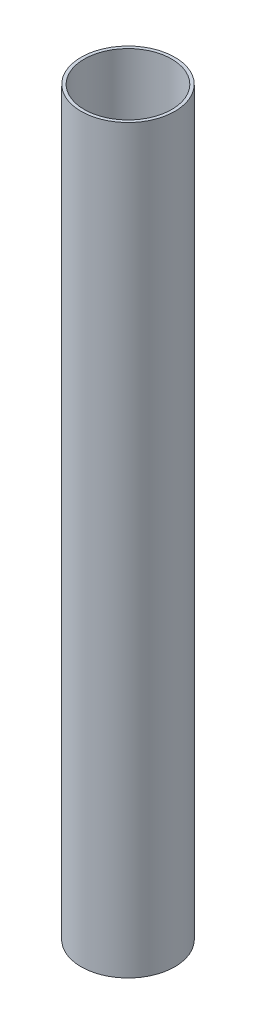
ISO-10303-21;
HEADER;
FILE_DESCRIPTION(('STEP AP214'),'2;1');
FILE_NAME('part.step','',(''),(''),'','','');
FILE_SCHEMA(('AUTOMOTIVE_DESIGN { 1 0 10303 214 1 1 1 1 }'));
ENDSEC;
DATA;
#1=APPLICATION_CONTEXT('core data for automotive mechanical design processes');
#2=APPLICATION_PROTOCOL_DEFINITION('international standard','automotive_design',2000,#1);
#3=PRODUCT_CONTEXT('',#1,'mechanical');
#4=PRODUCT('Part','Part','',(#3));
#5=PRODUCT_RELATED_PRODUCT_CATEGORY('part','',(#4));
#6=PRODUCT_DEFINITION_FORMATION('','',#4);
#7=PRODUCT_DEFINITION_CONTEXT('part definition',#1,'design');
#8=PRODUCT_DEFINITION('design','',#6,#7);
#9=PRODUCT_DEFINITION_SHAPE('','',#8);
#10=(LENGTH_UNIT() NAMED_UNIT(*) SI_UNIT(.MILLI.,.METRE.));
#11=(NAMED_UNIT(*) PLANE_ANGLE_UNIT() SI_UNIT($,.RADIAN.));
#12=(NAMED_UNIT(*) SI_UNIT($,.STERADIAN.) SOLID_ANGLE_UNIT());
#13=UNCERTAINTY_MEASURE_WITH_UNIT(LENGTH_MEASURE(1.E-05),#10,'distance_accuracy_value','');
#14=(GEOMETRIC_REPRESENTATION_CONTEXT(3) GLOBAL_UNCERTAINTY_ASSIGNED_CONTEXT((#13)) GLOBAL_UNIT_ASSIGNED_CONTEXT((#10,
#11,#12)) REPRESENTATION_CONTEXT('',''));
#15=CARTESIAN_POINT('',(0.,0.,0.));
#16=DIRECTION('',(0.,0.,1.));
#17=DIRECTION('',(1.,0.,0.));
#18=AXIS2_PLACEMENT_3D('',#15,#16,#17);
#19=CARTESIAN_POINT('',(0.,355.6,0.));
#20=DIRECTION('',(0.,1.,0.));
#21=DIRECTION('',(0.,0.,1.));
#22=AXIS2_PLACEMENT_3D('',#19,#20,#21);
#23=PLANE('',#22);
#24=CARTESIAN_POINT('',(0.,355.6,0.));
#25=DIRECTION('',(0.,1.,0.));
#26=DIRECTION('',(0.,0.,1.));
#27=AXIS2_PLACEMENT_3D('',#24,#25,#26);
#28=CIRCLE('',#27,22.5);
#29=CARTESIAN_POINT('',(0.,355.6,22.5));
#30=VERTEX_POINT('',#29);
#31=EDGE_CURVE('E10',#30,#30,#28,.T.);
#32=ORIENTED_EDGE('',*,*,#31,.T.);
#33=EDGE_LOOP('',(#32));
#34=FACE_BOUND('',#33,.T.);
#35=CARTESIAN_POINT('',(0.,355.6,0.));
#36=DIRECTION('',(0.,1.,0.));
#37=DIRECTION('',(0.,0.,1.));
#38=AXIS2_PLACEMENT_3D('',#35,#36,#37);
#39=CIRCLE('',#38,21.);
#40=CARTESIAN_POINT('',(0.,355.6,21.));
#41=VERTEX_POINT('',#40);
#42=EDGE_CURVE('E56',#41,#41,#39,.T.);
#43=ORIENTED_EDGE('',*,*,#42,.F.);
#44=EDGE_LOOP('',(#43));
#45=FACE_BOUND('',#44,.T.);
#46=ADVANCED_FACE('F43',(#34,#45),#23,.T.);
#47=CARTESIAN_POINT('',(0.,0.,0.));
#48=DIRECTION('',(0.,1.,0.));
#49=DIRECTION('',(0.,0.,1.));
#50=AXIS2_PLACEMENT_3D('',#47,#48,#49);
#51=PLANE('',#50);
#52=CARTESIAN_POINT('',(0.,0.,0.));
#53=DIRECTION('',(0.,1.,0.));
#54=DIRECTION('',(0.,0.,1.));
#55=AXIS2_PLACEMENT_3D('',#52,#53,#54);
#56=CIRCLE('',#55,22.5);
#57=CARTESIAN_POINT('',(0.,0.,22.5));
#58=VERTEX_POINT('',#57);
#59=EDGE_CURVE('E47',#58,#58,#56,.T.);
#60=ORIENTED_EDGE('',*,*,#59,.F.);
#61=EDGE_LOOP('',(#60));
#62=FACE_BOUND('',#61,.T.);
#63=CARTESIAN_POINT('',(0.,0.,0.));
#64=DIRECTION('',(0.,1.,0.));
#65=DIRECTION('',(0.,0.,1.));
#66=AXIS2_PLACEMENT_3D('',#63,#64,#65);
#67=CIRCLE('',#66,21.);
#68=CARTESIAN_POINT('',(0.,0.,21.));
#69=VERTEX_POINT('',#68);
#70=EDGE_CURVE('E58',#69,#69,#67,.T.);
#71=ORIENTED_EDGE('',*,*,#70,.T.);
#72=EDGE_LOOP('',(#71));
#73=FACE_BOUND('',#72,.T.);
#74=ADVANCED_FACE('F70',(#62,#73),#51,.F.);
#75=CARTESIAN_POINT('',(0.,355.6,0.));
#76=DIRECTION('',(0.,-1.,0.));
#77=DIRECTION('',(0.,0.,-1.));
#78=AXIS2_PLACEMENT_3D('',#75,#76,#77);
#79=CYLINDRICAL_SURFACE('',#78,22.5);
#80=ORIENTED_EDGE('',*,*,#31,.F.);
#81=EDGE_LOOP('',(#80));
#82=FACE_BOUND('',#81,.T.);
#83=ORIENTED_EDGE('',*,*,#59,.T.);
#84=EDGE_LOOP('',(#83));
#85=FACE_BOUND('',#84,.T.);
#86=ADVANCED_FACE('F45',(#82,#85),#79,.T.);
#87=CARTESIAN_POINT('',(0.,355.6,0.));
#88=DIRECTION('',(0.,-1.,0.));
#89=DIRECTION('',(0.,0.,-1.));
#90=AXIS2_PLACEMENT_3D('',#87,#88,#89);
#91=CYLINDRICAL_SURFACE('',#90,21.);
#92=ORIENTED_EDGE('',*,*,#42,.T.);
#93=EDGE_LOOP('',(#92));
#94=FACE_BOUND('',#93,.T.);
#95=ORIENTED_EDGE('',*,*,#70,.F.);
#96=EDGE_LOOP('',(#95));
#97=FACE_BOUND('',#96,.T.);
#98=ADVANCED_FACE('F66',(#94,#97),#91,.F.);
#99=CLOSED_SHELL('',(#46,#74,#86,#98));
#100=MANIFOLD_SOLID_BREP('B2',#99);
#101=ADVANCED_BREP_SHAPE_REPRESENTATION('',(#18,#100),#14);
#102=SHAPE_DEFINITION_REPRESENTATION(#9,#101);
ENDSEC;
END-ISO-10303-21;
